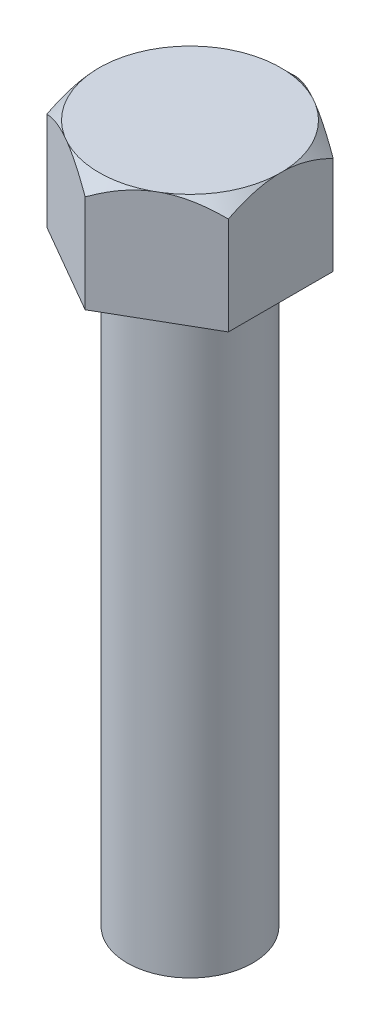
ISO-10303-21;
HEADER;
FILE_DESCRIPTION(('STEP AP214'),'2;1');
FILE_NAME('part.step','',(''),(''),'','','');
FILE_SCHEMA(('AUTOMOTIVE_DESIGN { 1 0 10303 214 1 1 1 1 }'));
ENDSEC;
DATA;
#1=APPLICATION_CONTEXT('core data for automotive mechanical design processes');
#2=APPLICATION_PROTOCOL_DEFINITION('international standard','automotive_design',2000,#1);
#3=PRODUCT_CONTEXT('',#1,'mechanical');
#4=PRODUCT('Part','Part','',(#3));
#5=PRODUCT_RELATED_PRODUCT_CATEGORY('part','',(#4));
#6=PRODUCT_DEFINITION_FORMATION('','',#4);
#7=PRODUCT_DEFINITION_CONTEXT('part definition',#1,'design');
#8=PRODUCT_DEFINITION('design','',#6,#7);
#9=PRODUCT_DEFINITION_SHAPE('','',#8);
#10=(LENGTH_UNIT() NAMED_UNIT(*) SI_UNIT(.MILLI.,.METRE.));
#11=(NAMED_UNIT(*) PLANE_ANGLE_UNIT() SI_UNIT($,.RADIAN.));
#12=(NAMED_UNIT(*) SI_UNIT($,.STERADIAN.) SOLID_ANGLE_UNIT());
#13=UNCERTAINTY_MEASURE_WITH_UNIT(LENGTH_MEASURE(1.E-05),#10,'distance_accuracy_value','');
#14=(GEOMETRIC_REPRESENTATION_CONTEXT(3) GLOBAL_UNCERTAINTY_ASSIGNED_CONTEXT((#13)) GLOBAL_UNIT_ASSIGNED_CONTEXT((#10,
#11,#12)) REPRESENTATION_CONTEXT('',''));
#15=CARTESIAN_POINT('',(0.,0.,0.));
#16=DIRECTION('',(0.,0.,1.));
#17=DIRECTION('',(1.,0.,0.));
#18=AXIS2_PLACEMENT_3D('',#15,#16,#17);
#19=CARTESIAN_POINT('',(3.25,-4.,-1.87638837486629));
#20=DIRECTION('',(0.5,0.,-0.866025403784439));
#21=DIRECTION('',(-0.866025403784439,0.,-0.5));
#22=AXIS2_PLACEMENT_3D('',#19,#20,#21);
#23=PLANE('',#22);
#24=DIRECTION('',(0.,1.,0.));
#25=VECTOR('',#24,1.);
#26=CARTESIAN_POINT('',(0.,-4.,-3.75277674973257));
#27=LINE('',#26,#25);
#28=CARTESIAN_POINT('',(0.,-4.,-3.75277674973257));
#29=VERTEX_POINT('',#28);
#30=CARTESIAN_POINT('',(0.,-0.5,-3.75277674973257));
#31=VERTEX_POINT('',#30);
#32=EDGE_CURVE('E162',#29,#31,#27,.T.);
#33=ORIENTED_EDGE('',*,*,#32,.T.);
#34=CARTESIAN_POINT('',(-0.000699999999999453,-0.500404210466393,-3.753180894921));
#35=CARTESIAN_POINT('',(0.111046289110584,-0.435928716845129,-3.68866414482206));
#36=CARTESIAN_POINT('',(0.224661416340914,-0.375238706332792,-3.62306842053162));
#37=CARTESIAN_POINT('',(0.456336795510823,-0.264114492129419,-3.48931057800326));
#38=CARTESIAN_POINT('',(0.574419104867048,-0.213742156608292,-3.42113572490991));
#39=CARTESIAN_POINT('',(0.812526722788285,-0.127452095032388,-3.28366422760699));
#40=CARTESIAN_POINT('',(0.932491326522309,-0.0913173683685298,-3.21440263134792));
#41=CARTESIAN_POINT('',(1.17506297029779,-0.0356431659341622,-3.07435382751638));
#42=CARTESIAN_POINT('',(1.29766258957158,-0.0160620995763418,-3.00357090432611));
#43=CARTESIAN_POINT('',(1.50893357896319,0.00160431422190845,-2.8815935417289));
#44=CARTESIAN_POINT('',(1.59733172548032,0.00422103869320926,-2.83055684804137));
#45=CARTESIAN_POINT('',(1.77398449926987,-0.000176864732752235,-2.72856632154088));
#46=CARTESIAN_POINT('',(1.86223906534411,-0.0071948703784979,-2.67761252406071));
#47=CARTESIAN_POINT('',(2.03791237642233,-0.0304615322641943,-2.57618749062026));
#48=CARTESIAN_POINT('',(2.12533007389141,-0.0467205243485501,-2.52571685945456));
#49=CARTESIAN_POINT('',(2.29866420436755,-0.0875816539233204,-2.42564235256441));
#50=CARTESIAN_POINT('',(2.38458075185332,-0.112183152262634,-2.37603841074565));
#51=CARTESIAN_POINT('',(2.53715630565944,-0.162816815310552,-2.28794887368393));
#52=CARTESIAN_POINT('',(2.60415207767239,-0.187521536095533,-2.24926884667769));
#53=CARTESIAN_POINT('',(2.73693998182797,-0.240915253935858,-2.17260371446834));
#54=CARTESIAN_POINT('',(2.80273207619929,-0.269604375779597,-2.13461863107251));
#55=CARTESIAN_POINT('',(2.93290543735243,-0.330322999297576,-2.05946300596942));
#56=CARTESIAN_POINT('',(2.99729040761077,-0.362342002422436,-2.02229032605901));
#57=CARTESIAN_POINT('',(3.12486702753078,-0.429299238945591,-1.94863393020589));
#58=CARTESIAN_POINT('',(3.18805938293488,-0.464235674989573,-1.9121498068026));
#59=CARTESIAN_POINT('',(3.2507,-0.500404210466393,-1.87598422967785));
#60=B_SPLINE_CURVE_WITH_KNOTS('',3,(#34,#35,#36,#37,#38,#39,#40,#41,#42,#43,#44,#45,#46,#47,#48,
#49,#50,#51,#52,#53,#54,#55,#56,#57,#58,#59),.UNSPECIFIED.,.F.,.F.,(4,2,2,2,2,2,2,2,2,2,2,2,4),
(0.,0.433036137444976,0.8685974297044,1.29723645069768,1.72479530070442,2.03068303837048,
2.33667804170129,2.6430159692716,2.94933043242986,3.1928430014064,3.43636319873104,
3.67913764567817,3.9217636137246),.UNSPECIFIED.);
#61=CARTESIAN_POINT('',(1.50862802012264,0.,-2.88176995620775));
#62=VERTEX_POINT('',#61);
#63=EDGE_CURVE('E240',#31,#62,#60,.T.);
#64=ORIENTED_EDGE('',*,*,#63,.T.);
#65=DIRECTION('',(-0.866025403784439,0.,-0.5));
#66=VECTOR('',#65,1.);
#67=CARTESIAN_POINT('',(3.25,0.,-1.87638837486629));
#68=LINE('',#67,#66);
#69=CARTESIAN_POINT('',(1.74137197987736,0.,-2.7473951683911));
#70=VERTEX_POINT('',#69);
#71=EDGE_CURVE('E190',#70,#62,#68,.T.);
#72=ORIENTED_EDGE('',*,*,#71,.F.);
#73=CARTESIAN_POINT('',(3.25,-0.5,-1.87638837486629));
#74=VERTEX_POINT('',#73);
#75=EDGE_CURVE('E193',#70,#74,#60,.T.);
#76=ORIENTED_EDGE('',*,*,#75,.T.);
#77=DIRECTION('',(0.,1.,0.));
#78=VECTOR('',#77,1.);
#79=CARTESIAN_POINT('',(3.25,-4.,-1.87638837486629));
#80=LINE('',#79,#78);
#81=CARTESIAN_POINT('',(3.25,-4.,-1.87638837486629));
#82=VERTEX_POINT('',#81);
#83=EDGE_CURVE('E153',#82,#74,#80,.T.);
#84=ORIENTED_EDGE('',*,*,#83,.F.);
#85=DIRECTION('',(-0.866025403784439,0.,-0.5));
#86=VECTOR('',#85,1.);
#87=CARTESIAN_POINT('',(3.25,-4.,-1.87638837486629));
#88=LINE('',#87,#86);
#89=EDGE_CURVE('E180',#82,#29,#88,.T.);
#90=ORIENTED_EDGE('',*,*,#89,.T.);
#91=EDGE_LOOP('',(#33,#64,#72,#76,#84,#90));
#92=FACE_BOUND('',#91,.T.);
#93=ADVANCED_FACE('F39',(#92),#23,.T.);
#94=CARTESIAN_POINT('',(3.25,-4.,1.87638837486629));
#95=DIRECTION('',(1.,0.,0.));
#96=DIRECTION('',(0.,0.,-1.));
#97=AXIS2_PLACEMENT_3D('',#94,#95,#96);
#98=PLANE('',#97);
#99=ORIENTED_EDGE('',*,*,#83,.T.);
#100=CARTESIAN_POINT('',(3.25,-0.500350048959176,-1.87708837486628));
#101=CARTESIAN_POINT('',(3.25,-0.435880585520191,-1.74806140663063));
#102=CARTESIAN_POINT('',(3.25,-0.375196505646868,-1.61687666526746));
#103=CARTESIAN_POINT('',(3.25,-0.264083605214065,-1.34937504006712));
#104=CARTESIAN_POINT('',(3.25,-0.213716638631236,-1.21303269360306));
#105=CARTESIAN_POINT('',(3.25,-0.127436028802705,-0.938104609834275));
#106=CARTESIAN_POINT('',(3.25,-0.0913054318427123,-0.799588949298755));
#107=CARTESIAN_POINT('',(3.25,-0.0356378331150507,-0.519506890536665));
#108=CARTESIAN_POINT('',(3.25,-0.0160592520458674,-0.377949058173769));
#109=CARTESIAN_POINT('',(3.25,0.001605096555193,-0.134002756973397));
#110=CARTESIAN_POINT('',(3.25,0.0042212127356993,-0.0319296834727881));
#111=CARTESIAN_POINT('',(3.25,-0.000177838029416273,0.172050683222064));
#112=CARTESIAN_POINT('',(3.25,-0.007196382447676,0.273957905736446));
#113=CARTESIAN_POINT('',(3.25,-0.0304640191002297,0.476807166926646));
#114=CARTESIAN_POINT('',(3.25,-0.0467234449839784,0.577747996214987));
#115=CARTESIAN_POINT('',(3.25,-0.0875853278562479,0.777896129107227));
#116=CARTESIAN_POINT('',(3.25,-0.112187145608934,0.877103564920145));
#117=CARTESIAN_POINT('',(3.25,-0.162818217398543,1.05327116771118));
#118=CARTESIAN_POINT('',(3.25,-0.187519424860453,1.13062038138379));
#119=CARTESIAN_POINT('',(3.25,-0.240905039611478,1.28392934985117));
#120=CARTESIAN_POINT('',(3.25,-0.269589571030034,1.35988906126237));
#121=CARTESIAN_POINT('',(3.25,-0.330298172486236,1.51017979923945));
#122=CARTESIAN_POINT('',(3.25,-0.362311745641663,1.58451510140433));
#123=CARTESIAN_POINT('',(3.25,-0.429257473386471,1.731808162804));
#124=CARTESIAN_POINT('',(3.25,-0.464187832130011,1.80476673624554));
#125=CARTESIAN_POINT('',(3.25,-0.500350048959177,1.87708837486629));
#126=B_SPLINE_CURVE_WITH_KNOTS('',3,(#100,#101,#102,#103,#104,#105,#106,#107,#108,#109,#110,
#111,#112,#113,#114,#115,#116,#117,#118,#119,#120,#121,#122,#123,#124,#125),.UNSPECIFIED.,.F.,
.F.,(4,2,2,2,2,2,2,2,2,2,2,2,4),(0.,0.433010464698973,0.868545507974875,1.2971596395815,
1.72469384938688,2.03058059883779,2.33657460562121,2.64291146648746,2.9492248595918,
3.19270329602768,3.43618932150923,3.67892963531958,3.92152158217097),.UNSPECIFIED.);
#127=CARTESIAN_POINT('',(3.25,0.,-0.134374787816675));
#128=VERTEX_POINT('',#127);
#129=EDGE_CURVE('E212',#74,#128,#126,.T.);
#130=ORIENTED_EDGE('',*,*,#129,.T.);
#131=DIRECTION('',(0.,0.,-1.));
#132=VECTOR('',#131,1.);
#133=CARTESIAN_POINT('',(3.25,0.,1.87638837486629));
#134=LINE('',#133,#132);
#135=CARTESIAN_POINT('',(3.25,0.,0.134374787816674));
#136=VERTEX_POINT('',#135);
#137=EDGE_CURVE('E177',#136,#128,#134,.T.);
#138=ORIENTED_EDGE('',*,*,#137,.F.);
#139=CARTESIAN_POINT('',(3.25,-0.5,1.87638837486629));
#140=VERTEX_POINT('',#139);
#141=EDGE_CURVE('E55',#136,#140,#126,.T.);
#142=ORIENTED_EDGE('',*,*,#141,.T.);
#143=DIRECTION('',(0.,1.,0.));
#144=VECTOR('',#143,1.);
#145=CARTESIAN_POINT('',(3.25,-4.,1.87638837486629));
#146=LINE('',#145,#144);
#147=CARTESIAN_POINT('',(3.25,-4.,1.87638837486629));
#148=VERTEX_POINT('',#147);
#149=EDGE_CURVE('E150',#148,#140,#146,.T.);
#150=ORIENTED_EDGE('',*,*,#149,.F.);
#151=DIRECTION('',(0.,0.,-1.));
#152=VECTOR('',#151,1.);
#153=CARTESIAN_POINT('',(3.25,-4.,1.87638837486629));
#154=LINE('',#153,#152);
#155=EDGE_CURVE('E165',#148,#82,#154,.T.);
#156=ORIENTED_EDGE('',*,*,#155,.T.);
#157=EDGE_LOOP('',(#99,#130,#138,#142,#150,#156));
#158=FACE_BOUND('',#157,.T.);
#159=ADVANCED_FACE('F218',(#158),#98,.T.);
#160=CARTESIAN_POINT('',(0.,-4.,3.75277674973257));
#161=DIRECTION('',(0.5,0.,0.866025403784439));
#162=DIRECTION('',(0.866025403784439,0.,-0.5));
#163=AXIS2_PLACEMENT_3D('',#160,#161,#162);
#164=PLANE('',#163);
#165=ORIENTED_EDGE('',*,*,#149,.T.);
#166=CARTESIAN_POINT('',(3.2507,-0.500404210466394,1.87598422967785));
#167=CARTESIAN_POINT('',(3.13895371088942,-0.435928716845129,1.94050097977679));
#168=CARTESIAN_POINT('',(3.02533858365909,-0.375238706332791,2.00609670406723));
#169=CARTESIAN_POINT('',(2.79366320448918,-0.264114492129418,2.13985454659559));
#170=CARTESIAN_POINT('',(2.67558089513295,-0.213742156608291,2.20802939968894));
#171=CARTESIAN_POINT('',(2.43747327721171,-0.127452095032388,2.34550089699187));
#172=CARTESIAN_POINT('',(2.31750867347769,-0.09131736836853,2.41476249325093));
#173=CARTESIAN_POINT('',(2.07493702970221,-0.0356431659341625,2.55481129708248));
#174=CARTESIAN_POINT('',(1.95233741042842,-0.0160620995763421,2.62559422027275));
#175=CARTESIAN_POINT('',(1.74106642103681,0.00160431422190814,2.74757158286995));
#176=CARTESIAN_POINT('',(1.65266827451967,0.00422103869320901,2.79860827655748));
#177=CARTESIAN_POINT('',(1.47601550073013,-0.000176864732752426,2.90059880305797));
#178=CARTESIAN_POINT('',(1.38776093465588,-0.00719487037849812,2.95155260053815));
#179=CARTESIAN_POINT('',(1.21208762357767,-0.0304615322641947,3.05297763397859));
#180=CARTESIAN_POINT('',(1.12466992610859,-0.0467205243485507,3.1034482651443));
#181=CARTESIAN_POINT('',(0.951335795632451,-0.0875816539233209,3.20352277203445));
#182=CARTESIAN_POINT('',(0.865419248146676,-0.112183152262634,3.2531267138532));
#183=CARTESIAN_POINT('',(0.712843694340553,-0.162816815310552,3.34121625091492));
#184=CARTESIAN_POINT('',(0.64584792232761,-0.187521536095534,3.37989627792116));
#185=CARTESIAN_POINT('',(0.513060018172024,-0.240915253935859,3.45656141013052));
#186=CARTESIAN_POINT('',(0.447267923800711,-0.269604375779597,3.49454649352634));
#187=CARTESIAN_POINT('',(0.317094562647567,-0.330322999297577,3.56970211862943));
#188=CARTESIAN_POINT('',(0.252709592389229,-0.362342002422436,3.60687479853985));
#189=CARTESIAN_POINT('',(0.125132972469219,-0.429299238945591,3.68053119439297));
#190=CARTESIAN_POINT('',(0.0619406170651193,-0.464235674989573,3.71701531779625));
#191=CARTESIAN_POINT('',(-0.000699999999999937,-0.500404210466393,3.753180894921));
#192=B_SPLINE_CURVE_WITH_KNOTS('',3,(#166,#167,#168,#169,#170,#171,#172,#173,#174,#175,#176,
#177,#178,#179,#180,#181,#182,#183,#184,#185,#186,#187,#188,#189,#190,#191),.UNSPECIFIED.,.F.,
.F.,(4,2,2,2,2,2,2,2,2,2,2,2,4),(0.,0.433036137444977,0.868597429704401,1.29723645069768,
1.72479530070442,2.03068303837048,2.33667804170129,2.6430159692716,2.94933043242986,
3.1928430014064,3.43636319873104,3.67913764567817,3.9217636137246),.UNSPECIFIED.);
#193=CARTESIAN_POINT('',(1.74137197987735,0.,2.74739516839111));
#194=VERTEX_POINT('',#193);
#195=EDGE_CURVE('E144',#140,#194,#192,.T.);
#196=ORIENTED_EDGE('',*,*,#195,.T.);
#197=DIRECTION('',(0.866025403784439,0.,-0.5));
#198=VECTOR('',#197,1.);
#199=CARTESIAN_POINT('',(0.,0.,3.75277674973257));
#200=LINE('',#199,#198);
#201=CARTESIAN_POINT('',(1.50862802012265,0.,2.88176995620774));
#202=VERTEX_POINT('',#201);
#203=EDGE_CURVE('E143',#202,#194,#200,.T.);
#204=ORIENTED_EDGE('',*,*,#203,.F.);
#205=CARTESIAN_POINT('',(0.,-0.5,3.75277674973257));
#206=VERTEX_POINT('',#205);
#207=EDGE_CURVE('E62',#202,#206,#192,.T.);
#208=ORIENTED_EDGE('',*,*,#207,.T.);
#209=DIRECTION('',(0.,1.,0.));
#210=VECTOR('',#209,1.);
#211=CARTESIAN_POINT('',(0.,-4.,3.75277674973257));
#212=LINE('',#211,#210);
#213=CARTESIAN_POINT('',(0.,-4.,3.75277674973257));
#214=VERTEX_POINT('',#213);
#215=EDGE_CURVE('E139',#214,#206,#212,.T.);
#216=ORIENTED_EDGE('',*,*,#215,.F.);
#217=DIRECTION('',(0.866025403784439,0.,-0.5));
#218=VECTOR('',#217,1.);
#219=CARTESIAN_POINT('',(0.,-4.,3.75277674973257));
#220=LINE('',#219,#218);
#221=EDGE_CURVE('E195',#214,#148,#220,.T.);
#222=ORIENTED_EDGE('',*,*,#221,.T.);
#223=EDGE_LOOP('',(#165,#196,#204,#208,#216,#222));
#224=FACE_BOUND('',#223,.T.);
#225=ADVANCED_FACE('F137',(#224),#164,.T.);
#226=CARTESIAN_POINT('',(-3.25,-4.,1.87638837486628));
#227=DIRECTION('',(-0.5,0.,0.866025403784439));
#228=DIRECTION('',(0.866025403784439,0.,0.5));
#229=AXIS2_PLACEMENT_3D('',#226,#227,#228);
#230=PLANE('',#229);
#231=ORIENTED_EDGE('',*,*,#215,.T.);
#232=CARTESIAN_POINT('',(0.000700000000000252,-0.500404210466393,3.753180894921));
#233=CARTESIAN_POINT('',(-0.111046289110583,-0.435928716845128,3.68866414482206));
#234=CARTESIAN_POINT('',(-0.224661416340913,-0.37523870633279,3.62306842053162));
#235=CARTESIAN_POINT('',(-0.456336795510822,-0.264114492129418,3.48931057800326));
#236=CARTESIAN_POINT('',(-0.574419104867047,-0.213742156608291,3.42113572490991));
#237=CARTESIAN_POINT('',(-0.812526722788285,-0.127452095032387,3.28366422760699));
#238=CARTESIAN_POINT('',(-0.932491326522309,-0.0913173683685284,3.21440263134792));
#239=CARTESIAN_POINT('',(-1.17506297029779,-0.0356431659341606,3.07435382751638));
#240=CARTESIAN_POINT('',(-1.29766258957158,-0.0160620995763403,3.00357090432611));
#241=CARTESIAN_POINT('',(-1.50893357896319,0.0016043142219098,2.8815935417289));
#242=CARTESIAN_POINT('',(-1.59733172548032,0.00422103869321062,2.83055684804137));
#243=CARTESIAN_POINT('',(-1.77398449926987,-0.000176864732750989,2.72856632154088));
#244=CARTESIAN_POINT('',(-1.86223906534411,-0.00719487037849677,2.67761252406071));
#245=CARTESIAN_POINT('',(-2.03791237642233,-0.0304615322641932,2.57618749062026));
#246=CARTESIAN_POINT('',(-2.12533007389141,-0.046720524348549,2.52571685945455));
#247=CARTESIAN_POINT('',(-2.29866420436755,-0.0875816539233192,2.42564235256441));
#248=CARTESIAN_POINT('',(-2.38458075185332,-0.112183152262632,2.37603841074565));
#249=CARTESIAN_POINT('',(-2.53715630565944,-0.162816815310551,2.28794887368393));
#250=CARTESIAN_POINT('',(-2.60415207767239,-0.187521536095532,2.24926884667769));
#251=CARTESIAN_POINT('',(-2.73693998182797,-0.240915253935857,2.17260371446834));
#252=CARTESIAN_POINT('',(-2.80273207619929,-0.269604375779596,2.13461863107251));
#253=CARTESIAN_POINT('',(-2.93290543735243,-0.330322999297575,2.05946300596942));
#254=CARTESIAN_POINT('',(-2.99729040761077,-0.362342002422435,2.02229032605901));
#255=CARTESIAN_POINT('',(-3.12486702753078,-0.42929923894559,1.94863393020588));
#256=CARTESIAN_POINT('',(-3.18805938293488,-0.464235674989572,1.9121498068026));
#257=CARTESIAN_POINT('',(-3.2507,-0.500404210466393,1.87598422967785));
#258=B_SPLINE_CURVE_WITH_KNOTS('',3,(#232,#233,#234,#235,#236,#237,#238,#239,#240,#241,#242,
#243,#244,#245,#246,#247,#248,#249,#250,#251,#252,#253,#254,#255,#256,#257),.UNSPECIFIED.,.F.,
.F.,(4,2,2,2,2,2,2,2,2,2,2,2,4),(0.,0.433036137444976,0.868597429704401,1.29723645069768,
1.72479530070442,2.03068303837048,2.33667804170129,2.6430159692716,2.94933043242986,
3.1928430014064,3.43636319873104,3.67913764567817,3.9217636137246),.UNSPECIFIED.);
#259=CARTESIAN_POINT('',(-1.50862802012262,0.,2.88176995620776));
#260=VERTEX_POINT('',#259);
#261=EDGE_CURVE('E126',#206,#260,#258,.T.);
#262=ORIENTED_EDGE('',*,*,#261,.T.);
#263=DIRECTION('',(0.866025403784439,0.,0.5));
#264=VECTOR('',#263,1.);
#265=CARTESIAN_POINT('',(-3.25,0.,1.87638837486628));
#266=LINE('',#265,#264);
#267=CARTESIAN_POINT('',(-1.74137197987738,0.,2.74739516839109));
#268=VERTEX_POINT('',#267);
#269=EDGE_CURVE('E182',#268,#260,#266,.T.);
#270=ORIENTED_EDGE('',*,*,#269,.F.);
#271=CARTESIAN_POINT('',(-3.25,-0.5,1.87638837486629));
#272=VERTEX_POINT('',#271);
#273=EDGE_CURVE('E132',#268,#272,#258,.T.);
#274=ORIENTED_EDGE('',*,*,#273,.T.);
#275=DIRECTION('',(0.,1.,0.));
#276=VECTOR('',#275,1.);
#277=CARTESIAN_POINT('',(-3.25,-4.,1.87638837486628));
#278=LINE('',#277,#276);
#279=CARTESIAN_POINT('',(-3.25,-4.,1.87638837486628));
#280=VERTEX_POINT('',#279);
#281=EDGE_CURVE('E151',#280,#272,#278,.T.);
#282=ORIENTED_EDGE('',*,*,#281,.F.);
#283=DIRECTION('',(0.866025403784439,0.,0.5));
#284=VECTOR('',#283,1.);
#285=CARTESIAN_POINT('',(-3.25,-4.,1.87638837486628));
#286=LINE('',#285,#284);
#287=EDGE_CURVE('E149',#280,#214,#286,.T.);
#288=ORIENTED_EDGE('',*,*,#287,.T.);
#289=EDGE_LOOP('',(#231,#262,#270,#274,#282,#288));
#290=FACE_BOUND('',#289,.T.);
#291=ADVANCED_FACE('F147',(#290),#230,.T.);
#292=CARTESIAN_POINT('',(-3.25,-4.,-1.87638837486628));
#293=DIRECTION('',(-1.,0.,0.));
#294=DIRECTION('',(0.,0.,1.));
#295=AXIS2_PLACEMENT_3D('',#292,#293,#294);
#296=PLANE('',#295);
#297=ORIENTED_EDGE('',*,*,#281,.T.);
#298=CARTESIAN_POINT('',(-3.25,-0.500350048959176,1.87708837486628));
#299=CARTESIAN_POINT('',(-3.25,-0.435880585520191,1.74806140663062));
#300=CARTESIAN_POINT('',(-3.25,-0.375196505646867,1.61687666526746));
#301=CARTESIAN_POINT('',(-3.25,-0.264083605214065,1.34937504006711));
#302=CARTESIAN_POINT('',(-3.25,-0.213716638631236,1.21303269360306));
#303=CARTESIAN_POINT('',(-3.25,-0.127436028802705,0.938104609834273));
#304=CARTESIAN_POINT('',(-3.25,-0.0913054318427125,0.799588949298754));
#305=CARTESIAN_POINT('',(-3.25,-0.035637833115051,0.519506890536664));
#306=CARTESIAN_POINT('',(-3.25,-0.0160592520458677,0.377949058173769));
#307=CARTESIAN_POINT('',(-3.25,0.00160509655519278,0.134002756973396));
#308=CARTESIAN_POINT('',(-3.25,0.00422121273569909,0.0319296834727875));
#309=CARTESIAN_POINT('',(-3.25,-0.000177838029416475,-0.172050683222065));
#310=CARTESIAN_POINT('',(-3.25,-0.00719638244767619,-0.273957905736446));
#311=CARTESIAN_POINT('',(-3.25,-0.0304640191002299,-0.476807166926647));
#312=CARTESIAN_POINT('',(-3.25,-0.0467234449839785,-0.577747996214987));
#313=CARTESIAN_POINT('',(-3.25,-0.087585327856248,-0.777896129107227));
#314=CARTESIAN_POINT('',(-3.25,-0.112187145608934,-0.877103564920145));
#315=CARTESIAN_POINT('',(-3.25,-0.162818217398543,-1.05327116771118));
#316=CARTESIAN_POINT('',(-3.25,-0.187519424860453,-1.13062038138379));
#317=CARTESIAN_POINT('',(-3.25,-0.240905039611478,-1.28392934985116));
#318=CARTESIAN_POINT('',(-3.25,-0.269589571030034,-1.35988906126237));
#319=CARTESIAN_POINT('',(-3.25,-0.330298172486236,-1.51017979923945));
#320=CARTESIAN_POINT('',(-3.25,-0.362311745641663,-1.58451510140433));
#321=CARTESIAN_POINT('',(-3.25,-0.42925747338647,-1.731808162804));
#322=CARTESIAN_POINT('',(-3.25,-0.464187832130011,-1.80476673624554));
#323=CARTESIAN_POINT('',(-3.25,-0.500350048959177,-1.87708837486628));
#324=B_SPLINE_CURVE_WITH_KNOTS('',3,(#298,#299,#300,#301,#302,#303,#304,#305,#306,#307,#308,
#309,#310,#311,#312,#313,#314,#315,#316,#317,#318,#319,#320,#321,#322,#323),.UNSPECIFIED.,.F.,
.F.,(4,2,2,2,2,2,2,2,2,2,2,2,4),(0.,0.433010464698973,0.868545507974874,1.2971596395815,
1.72469384938688,2.03058059883779,2.33657460562121,2.64291146648746,2.9492248595918,
3.19270329602768,3.43618932150923,3.67892963531958,3.92152158217097),.UNSPECIFIED.);
#325=CARTESIAN_POINT('',(-3.25,0.,0.134374787816662));
#326=VERTEX_POINT('',#325);
#327=EDGE_CURVE('E260',#272,#326,#324,.T.);
#328=ORIENTED_EDGE('',*,*,#327,.T.);
#329=DIRECTION('',(0.,0.,1.));
#330=VECTOR('',#329,1.);
#331=CARTESIAN_POINT('',(-3.25,0.,-1.87638837486628));
#332=LINE('',#331,#330);
#333=CARTESIAN_POINT('',(-3.25,0.,-0.134374787816662));
#334=VERTEX_POINT('',#333);
#335=EDGE_CURVE('E184',#334,#326,#332,.T.);
#336=ORIENTED_EDGE('',*,*,#335,.F.);
#337=CARTESIAN_POINT('',(-3.25,-0.5,-1.87638837486629));
#338=VERTEX_POINT('',#337);
#339=EDGE_CURVE('E248',#334,#338,#324,.T.);
#340=ORIENTED_EDGE('',*,*,#339,.T.);
#341=DIRECTION('',(0.,1.,0.));
#342=VECTOR('',#341,1.);
#343=CARTESIAN_POINT('',(-3.25,-4.,-1.87638837486628));
#344=LINE('',#343,#342);
#345=CARTESIAN_POINT('',(-3.25,-4.,-1.87638837486628));
#346=VERTEX_POINT('',#345);
#347=EDGE_CURVE('E156',#346,#338,#344,.T.);
#348=ORIENTED_EDGE('',*,*,#347,.F.);
#349=DIRECTION('',(0.,0.,1.));
#350=VECTOR('',#349,1.);
#351=CARTESIAN_POINT('',(-3.25,-4.,-1.87638837486628));
#352=LINE('',#351,#350);
#353=EDGE_CURVE('E198',#346,#280,#352,.T.);
#354=ORIENTED_EDGE('',*,*,#353,.T.);
#355=EDGE_LOOP('',(#297,#328,#336,#340,#348,#354));
#356=FACE_BOUND('',#355,.T.);
#357=ADVANCED_FACE('F263',(#356),#296,.T.);
#358=CARTESIAN_POINT('',(0.,-4.,-3.75277674973257));
#359=DIRECTION('',(-0.5,0.,-0.866025403784439));
#360=DIRECTION('',(-0.866025403784439,0.,0.5));
#361=AXIS2_PLACEMENT_3D('',#358,#359,#360);
#362=PLANE('',#361);
#363=ORIENTED_EDGE('',*,*,#347,.T.);
#364=CARTESIAN_POINT('',(-3.2507,-0.500404210466393,-1.87598422967785));
#365=CARTESIAN_POINT('',(-3.13895371088942,-0.435928716845129,-1.94050097977679));
#366=CARTESIAN_POINT('',(-3.02533858365909,-0.375238706332791,-2.00609670406723));
#367=CARTESIAN_POINT('',(-2.79366320448918,-0.264114492129419,-2.13985454659559));
#368=CARTESIAN_POINT('',(-2.67558089513295,-0.213742156608292,-2.20802939968894));
#369=CARTESIAN_POINT('',(-2.43747327721172,-0.127452095032388,-2.34550089699187));
#370=CARTESIAN_POINT('',(-2.31750867347769,-0.09131736836853,-2.41476249325093));
#371=CARTESIAN_POINT('',(-2.07493702970221,-0.0356431659341624,-2.55481129708247));
#372=CARTESIAN_POINT('',(-1.95233741042842,-0.0160620995763418,-2.62559422027274));
#373=CARTESIAN_POINT('',(-1.74106642103681,0.00160431422190863,-2.74757158286995));
#374=CARTESIAN_POINT('',(-1.65266827451968,0.00422103869320949,-2.79860827655748));
#375=CARTESIAN_POINT('',(-1.47601550073013,-0.000176864732752035,-2.90059880305797));
#376=CARTESIAN_POINT('',(-1.38776093465589,-0.0071948703784978,-2.95155260053814));
#377=CARTESIAN_POINT('',(-1.21208762357767,-0.0304615322641941,-3.05297763397859));
#378=CARTESIAN_POINT('',(-1.12466992610859,-0.0467205243485498,-3.1034482651443));
#379=CARTESIAN_POINT('',(-0.951335795632454,-0.0875816539233198,-3.20352277203444));
#380=CARTESIAN_POINT('',(-0.865419248146679,-0.112183152262633,-3.2531267138532));
#381=CARTESIAN_POINT('',(-0.712843694340556,-0.162816815310551,-3.34121625091492));
#382=CARTESIAN_POINT('',(-0.645847922327613,-0.187521536095533,-3.37989627792116));
#383=CARTESIAN_POINT('',(-0.513060018172025,-0.240915253935858,-3.45656141013052));
#384=CARTESIAN_POINT('',(-0.447267923800712,-0.269604375779597,-3.49454649352634));
#385=CARTESIAN_POINT('',(-0.317094562647568,-0.330322999297577,-3.56970211862943));
#386=CARTESIAN_POINT('',(-0.252709592389229,-0.362342002422436,-3.60687479853985));
#387=CARTESIAN_POINT('',(-0.125132972469219,-0.429299238945591,-3.68053119439297));
#388=CARTESIAN_POINT('',(-0.0619406170651186,-0.464235674989573,-3.71701531779625));
#389=CARTESIAN_POINT('',(0.000700000000000651,-0.500404210466394,-3.753180894921));
#390=B_SPLINE_CURVE_WITH_KNOTS('',3,(#364,#365,#366,#367,#368,#369,#370,#371,#372,#373,#374,
#375,#376,#377,#378,#379,#380,#381,#382,#383,#384,#385,#386,#387,#388,#389),.UNSPECIFIED.,.F.,
.F.,(4,2,2,2,2,2,2,2,2,2,2,2,4),(0.,0.433036137444976,0.868597429704401,1.29723645069767,
1.72479530070442,2.03068303837048,2.33667804170129,2.6430159692716,2.94933043242986,
3.1928430014064,3.43636319873104,3.67913764567817,3.9217636137246),.UNSPECIFIED.);
#391=CARTESIAN_POINT('',(-1.74137197987735,0.,-2.74739516839111));
#392=VERTEX_POINT('',#391);
#393=EDGE_CURVE('E304',#338,#392,#390,.T.);
#394=ORIENTED_EDGE('',*,*,#393,.T.);
#395=DIRECTION('',(-0.866025403784439,0.,0.5));
#396=VECTOR('',#395,1.);
#397=CARTESIAN_POINT('',(0.,0.,-3.75277674973257));
#398=LINE('',#397,#396);
#399=CARTESIAN_POINT('',(-1.50862802012265,0.,-2.88176995620774));
#400=VERTEX_POINT('',#399);
#401=EDGE_CURVE('E187',#400,#392,#398,.T.);
#402=ORIENTED_EDGE('',*,*,#401,.F.);
#403=EDGE_CURVE('E231',#400,#31,#390,.T.);
#404=ORIENTED_EDGE('',*,*,#403,.T.);
#405=ORIENTED_EDGE('',*,*,#32,.F.);
#406=DIRECTION('',(-0.866025403784439,0.,0.5));
#407=VECTOR('',#406,1.);
#408=CARTESIAN_POINT('',(0.,-4.,-3.75277674973257));
#409=LINE('',#408,#407);
#410=EDGE_CURVE('E201',#29,#346,#409,.T.);
#411=ORIENTED_EDGE('',*,*,#410,.T.);
#412=EDGE_LOOP('',(#363,#394,#402,#404,#405,#411));
#413=FACE_BOUND('',#412,.T.);
#414=ADVANCED_FACE('F267',(#413),#362,.T.);
#415=CARTESIAN_POINT('',(0.,-25.,0.));
#416=DIRECTION('',(0.,1.,0.));
#417=DIRECTION('',(0.,0.,1.));
#418=AXIS2_PLACEMENT_3D('',#415,#416,#417);
#419=CYLINDRICAL_SURFACE('',#418,2.25);
#420=CARTESIAN_POINT('',(0.,-25.,0.));
#421=DIRECTION('',(0.,1.,0.));
#422=DIRECTION('',(0.,0.,1.));
#423=AXIS2_PLACEMENT_3D('',#420,#421,#422);
#424=CIRCLE('',#423,2.25);
#425=CARTESIAN_POINT('',(0.,-25.,2.25));
#426=VERTEX_POINT('',#425);
#427=EDGE_CURVE('E166',#426,#426,#424,.T.);
#428=ORIENTED_EDGE('',*,*,#427,.T.);
#429=EDGE_LOOP('',(#428));
#430=FACE_BOUND('',#429,.T.);
#431=CARTESIAN_POINT('',(0.,-4.,0.));
#432=DIRECTION('',(0.,1.,0.));
#433=DIRECTION('',(0.,0.,1.));
#434=AXIS2_PLACEMENT_3D('',#431,#432,#433);
#435=CIRCLE('',#434,2.25);
#436=CARTESIAN_POINT('',(0.,-4.,2.25));
#437=VERTEX_POINT('',#436);
#438=EDGE_CURVE('E168',#437,#437,#435,.F.);
#439=ORIENTED_EDGE('',*,*,#438,.T.);
#440=EDGE_LOOP('',(#439));
#441=FACE_BOUND('',#440,.T.);
#442=ADVANCED_FACE('F41',(#430,#441),#419,.T.);
#443=CARTESIAN_POINT('',(0.,-25.,0.));
#444=DIRECTION('',(0.,1.,0.));
#445=DIRECTION('',(0.,0.,1.));
#446=AXIS2_PLACEMENT_3D('',#443,#444,#445);
#447=PLANE('',#446);
#448=ORIENTED_EDGE('',*,*,#427,.F.);
#449=EDGE_LOOP('',(#448));
#450=FACE_BOUND('',#449,.T.);
#451=ADVANCED_FACE('F276',(#450),#447,.F.);
#452=CARTESIAN_POINT('',(0.,-4.,0.));
#453=DIRECTION('',(0.,1.,0.));
#454=DIRECTION('',(0.,0.,1.));
#455=AXIS2_PLACEMENT_3D('',#452,#453,#454);
#456=PLANE('',#455);
#457=ORIENTED_EDGE('',*,*,#438,.F.);
#458=EDGE_LOOP('',(#457));
#459=FACE_BOUND('',#458,.T.);
#460=ORIENTED_EDGE('',*,*,#89,.F.);
#461=ORIENTED_EDGE('',*,*,#155,.F.);
#462=ORIENTED_EDGE('',*,*,#221,.F.);
#463=ORIENTED_EDGE('',*,*,#287,.F.);
#464=ORIENTED_EDGE('',*,*,#353,.F.);
#465=ORIENTED_EDGE('',*,*,#410,.F.);
#466=EDGE_LOOP('',(#460,#461,#462,#463,#464,#465));
#467=FACE_BOUND('',#466,.T.);
#468=ADVANCED_FACE('F227',(#459,#467),#456,.F.);
#469=CARTESIAN_POINT('',(0.,0.,0.));
#470=DIRECTION('',(0.,1.,0.));
#471=DIRECTION('',(0.,0.,1.));
#472=AXIS2_PLACEMENT_3D('',#469,#470,#471);
#473=PLANE('',#472);
#474=ORIENTED_EDGE('',*,*,#203,.T.);
#475=CARTESIAN_POINT('',(0.,0.,0.));
#476=DIRECTION('',(0.,1.,0.));
#477=DIRECTION('',(0.,0.,1.));
#478=AXIS2_PLACEMENT_3D('',#475,#476,#477);
#479=CIRCLE('',#478,3.25277674973257);
#480=EDGE_CURVE('E11',#194,#136,#479,.T.);
#481=ORIENTED_EDGE('',*,*,#480,.T.);
#482=ORIENTED_EDGE('',*,*,#137,.T.);
#483=EDGE_CURVE('E48',#128,#70,#479,.T.);
#484=ORIENTED_EDGE('',*,*,#483,.T.);
#485=ORIENTED_EDGE('',*,*,#71,.T.);
#486=EDGE_CURVE('E294',#62,#400,#479,.T.);
#487=ORIENTED_EDGE('',*,*,#486,.T.);
#488=ORIENTED_EDGE('',*,*,#401,.T.);
#489=EDGE_CURVE('E292',#392,#334,#479,.T.);
#490=ORIENTED_EDGE('',*,*,#489,.T.);
#491=ORIENTED_EDGE('',*,*,#335,.T.);
#492=EDGE_CURVE('E291',#326,#268,#479,.T.);
#493=ORIENTED_EDGE('',*,*,#492,.T.);
#494=ORIENTED_EDGE('',*,*,#269,.T.);
#495=EDGE_CURVE('E43',#260,#202,#479,.T.);
#496=ORIENTED_EDGE('',*,*,#495,.T.);
#497=EDGE_LOOP('',(#474,#481,#482,#484,#485,#487,#488,#490,#491,#493,#494,#496));
#498=FACE_BOUND('',#497,.T.);
#499=ADVANCED_FACE('F279',(#498),#473,.T.);
#500=CARTESIAN_POINT('',(0.,0.,0.));
#501=DIRECTION('',(0.,-1.,0.));
#502=DIRECTION('',(0.,0.,-1.));
#503=AXIS2_PLACEMENT_3D('',#500,#501,#502);
#504=CONICAL_SURFACE('',#503,3.25277674973257,0.785398163397449);
#505=ORIENTED_EDGE('',*,*,#495,.F.);
#506=ORIENTED_EDGE('',*,*,#261,.F.);
#507=ORIENTED_EDGE('',*,*,#207,.F.);
#508=EDGE_LOOP('',(#505,#506,#507));
#509=FACE_BOUND('',#508,.T.);
#510=ADVANCED_FACE('F127',(#509),#504,.T.);
#511=ORIENTED_EDGE('',*,*,#492,.F.);
#512=ORIENTED_EDGE('',*,*,#327,.F.);
#513=ORIENTED_EDGE('',*,*,#273,.F.);
#514=EDGE_LOOP('',(#511,#512,#513));
#515=FACE_BOUND('',#514,.T.);
#516=ADVANCED_FACE('F285',(#515),#504,.T.);
#517=ORIENTED_EDGE('',*,*,#489,.F.);
#518=ORIENTED_EDGE('',*,*,#393,.F.);
#519=ORIENTED_EDGE('',*,*,#339,.F.);
#520=EDGE_LOOP('',(#517,#518,#519));
#521=FACE_BOUND('',#520,.T.);
#522=ADVANCED_FACE('F225',(#521),#504,.T.);
#523=ORIENTED_EDGE('',*,*,#403,.F.);
#524=ORIENTED_EDGE('',*,*,#486,.F.);
#525=ORIENTED_EDGE('',*,*,#63,.F.);
#526=EDGE_LOOP('',(#523,#524,#525));
#527=FACE_BOUND('',#526,.T.);
#528=ADVANCED_FACE('F221',(#527),#504,.T.);
#529=ORIENTED_EDGE('',*,*,#483,.F.);
#530=ORIENTED_EDGE('',*,*,#129,.F.);
#531=ORIENTED_EDGE('',*,*,#75,.F.);
#532=EDGE_LOOP('',(#529,#530,#531));
#533=FACE_BOUND('',#532,.T.);
#534=ADVANCED_FACE('F224',(#533),#504,.T.);
#535=ORIENTED_EDGE('',*,*,#480,.F.);
#536=ORIENTED_EDGE('',*,*,#195,.F.);
#537=ORIENTED_EDGE('',*,*,#141,.F.);
#538=EDGE_LOOP('',(#535,#536,#537));
#539=FACE_BOUND('',#538,.T.);
#540=ADVANCED_FACE('F286',(#539),#504,.T.);
#541=CLOSED_SHELL('',(#93,#159,#225,#291,#357,#414,#442,#451,#468,#499,#510,#516,#522,#528,#534,#540));
#542=MANIFOLD_SOLID_BREP('B2',#541);
#543=ADVANCED_BREP_SHAPE_REPRESENTATION('',(#18,#542),#14);
#544=SHAPE_DEFINITION_REPRESENTATION(#9,#543);
ENDSEC;
END-ISO-10303-21;
